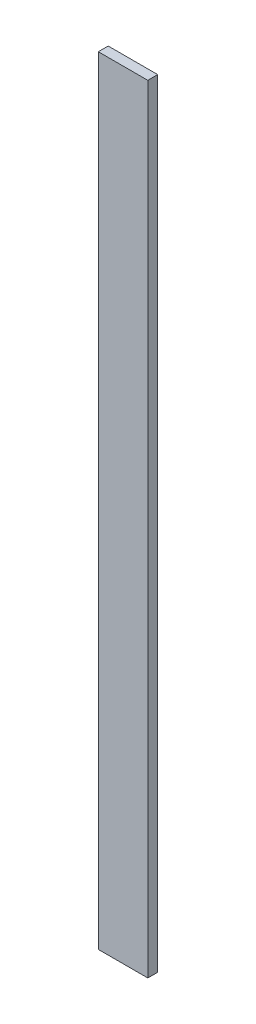
ISO-10303-21;
HEADER;
FILE_DESCRIPTION(('STEP AP214'),'2;1');
FILE_NAME('part.step','',(''),(''),'','','');
FILE_SCHEMA(('AUTOMOTIVE_DESIGN { 1 0 10303 214 1 1 1 1 }'));
ENDSEC;
DATA;
#1=APPLICATION_CONTEXT('core data for automotive mechanical design processes');
#2=APPLICATION_PROTOCOL_DEFINITION('international standard','automotive_design',2000,#1);
#3=PRODUCT_CONTEXT('',#1,'mechanical');
#4=PRODUCT('Part','Part','',(#3));
#5=PRODUCT_RELATED_PRODUCT_CATEGORY('part','',(#4));
#6=PRODUCT_DEFINITION_FORMATION('','',#4);
#7=PRODUCT_DEFINITION_CONTEXT('part definition',#1,'design');
#8=PRODUCT_DEFINITION('design','',#6,#7);
#9=PRODUCT_DEFINITION_SHAPE('','',#8);
#10=(LENGTH_UNIT() NAMED_UNIT(*) SI_UNIT(.MILLI.,.METRE.));
#11=(NAMED_UNIT(*) PLANE_ANGLE_UNIT() SI_UNIT($,.RADIAN.));
#12=(NAMED_UNIT(*) SI_UNIT($,.STERADIAN.) SOLID_ANGLE_UNIT());
#13=UNCERTAINTY_MEASURE_WITH_UNIT(LENGTH_MEASURE(1.E-05),#10,'distance_accuracy_value','');
#14=(GEOMETRIC_REPRESENTATION_CONTEXT(3) GLOBAL_UNCERTAINTY_ASSIGNED_CONTEXT((#13)) GLOBAL_UNIT_ASSIGNED_CONTEXT((#10,
#11,#12)) REPRESENTATION_CONTEXT('',''));
#15=CARTESIAN_POINT('',(0.,0.,0.));
#16=DIRECTION('',(0.,0.,1.));
#17=DIRECTION('',(1.,0.,0.));
#18=AXIS2_PLACEMENT_3D('',#15,#16,#17);
#19=CARTESIAN_POINT('',(196.488368909926,-43.8866022362076,2.));
#20=DIRECTION('',(-1.,0.,0.));
#21=DIRECTION('',(0.,0.,1.));
#22=AXIS2_PLACEMENT_3D('',#19,#20,#21);
#23=PLANE('',#22);
#24=DIRECTION('',(0.,1.,0.));
#25=VECTOR('',#24,1.);
#26=CARTESIAN_POINT('',(196.488368909926,-43.8866022362076,0.));
#27=LINE('',#26,#25);
#28=CARTESIAN_POINT('',(196.488368909926,-200.886602196958,0.));
#29=VERTEX_POINT('',#28);
#30=CARTESIAN_POINT('',(196.488368909926,-43.8866022362076,0.));
#31=VERTEX_POINT('',#30);
#32=EDGE_CURVE('E100',#29,#31,#27,.T.);
#33=ORIENTED_EDGE('',*,*,#32,.T.);
#34=DIRECTION('',(0.,0.,-1.));
#35=VECTOR('',#34,1.);
#36=CARTESIAN_POINT('',(196.488368909926,-43.8866022362076,2.));
#37=LINE('',#36,#35);
#38=CARTESIAN_POINT('',(196.488368909926,-43.8866022362076,2.));
#39=VERTEX_POINT('',#38);
#40=EDGE_CURVE('E11',#39,#31,#37,.T.);
#41=ORIENTED_EDGE('',*,*,#40,.F.);
#42=DIRECTION('',(0.,1.,0.));
#43=VECTOR('',#42,1.);
#44=CARTESIAN_POINT('',(196.488368909926,-43.8866022362076,2.));
#45=LINE('',#44,#43);
#46=CARTESIAN_POINT('',(196.488368909926,-200.886602196958,2.));
#47=VERTEX_POINT('',#46);
#48=EDGE_CURVE('E88',#47,#39,#45,.T.);
#49=ORIENTED_EDGE('',*,*,#48,.F.);
#50=DIRECTION('',(0.,0.,-1.));
#51=VECTOR('',#50,1.);
#52=CARTESIAN_POINT('',(196.488368909926,-200.886602196958,2.));
#53=LINE('',#52,#51);
#54=EDGE_CURVE('E96',#47,#29,#53,.T.);
#55=ORIENTED_EDGE('',*,*,#54,.T.);
#56=EDGE_LOOP('',(#33,#41,#49,#55));
#57=FACE_BOUND('',#56,.T.);
#58=ADVANCED_FACE('F37',(#57),#23,.F.);
#59=CARTESIAN_POINT('',(186.488368912426,-43.8866022362076,2.));
#60=DIRECTION('',(0.,-1.,0.));
#61=DIRECTION('',(0.,0.,-1.));
#62=AXIS2_PLACEMENT_3D('',#59,#60,#61);
#63=PLANE('',#62);
#64=DIRECTION('',(-1.,0.,0.));
#65=VECTOR('',#64,1.);
#66=CARTESIAN_POINT('',(186.488368912426,-43.8866022362076,0.));
#67=LINE('',#66,#65);
#68=CARTESIAN_POINT('',(186.488368912426,-43.8866022362076,0.));
#69=VERTEX_POINT('',#68);
#70=EDGE_CURVE('E92',#31,#69,#67,.T.);
#71=ORIENTED_EDGE('',*,*,#70,.T.);
#72=DIRECTION('',(0.,0.,-1.));
#73=VECTOR('',#72,1.);
#74=CARTESIAN_POINT('',(186.488368912426,-43.8866022362076,2.));
#75=LINE('',#74,#73);
#76=CARTESIAN_POINT('',(186.488368912426,-43.8866022362076,2.));
#77=VERTEX_POINT('',#76);
#78=EDGE_CURVE('E45',#77,#69,#75,.T.);
#79=ORIENTED_EDGE('',*,*,#78,.F.);
#80=DIRECTION('',(-1.,0.,0.));
#81=VECTOR('',#80,1.);
#82=CARTESIAN_POINT('',(186.488368912426,-43.8866022362076,2.));
#83=LINE('',#82,#81);
#84=EDGE_CURVE('E83',#39,#77,#83,.T.);
#85=ORIENTED_EDGE('',*,*,#84,.F.);
#86=ORIENTED_EDGE('',*,*,#40,.T.);
#87=EDGE_LOOP('',(#71,#79,#85,#86));
#88=FACE_BOUND('',#87,.T.);
#89=ADVANCED_FACE('F91',(#88),#63,.F.);
#90=CARTESIAN_POINT('',(186.488368912426,-200.886602196958,2.));
#91=DIRECTION('',(1.,0.,0.));
#92=DIRECTION('',(0.,0.,-1.));
#93=AXIS2_PLACEMENT_3D('',#90,#91,#92);
#94=PLANE('',#93);
#95=DIRECTION('',(0.,-1.,0.));
#96=VECTOR('',#95,1.);
#97=CARTESIAN_POINT('',(186.488368912426,-200.886602196958,0.));
#98=LINE('',#97,#96);
#99=CARTESIAN_POINT('',(186.488368912426,-200.886602196958,0.));
#100=VERTEX_POINT('',#99);
#101=EDGE_CURVE('E70',#69,#100,#98,.T.);
#102=ORIENTED_EDGE('',*,*,#101,.T.);
#103=DIRECTION('',(0.,0.,-1.));
#104=VECTOR('',#103,1.);
#105=CARTESIAN_POINT('',(186.488368912426,-200.886602196958,2.));
#106=LINE('',#105,#104);
#107=CARTESIAN_POINT('',(186.488368912426,-200.886602196958,2.));
#108=VERTEX_POINT('',#107);
#109=EDGE_CURVE('E93',#108,#100,#106,.T.);
#110=ORIENTED_EDGE('',*,*,#109,.F.);
#111=DIRECTION('',(0.,-1.,0.));
#112=VECTOR('',#111,1.);
#113=CARTESIAN_POINT('',(186.488368912426,-200.886602196958,2.));
#114=LINE('',#113,#112);
#115=EDGE_CURVE('E86',#77,#108,#114,.T.);
#116=ORIENTED_EDGE('',*,*,#115,.F.);
#117=ORIENTED_EDGE('',*,*,#78,.T.);
#118=EDGE_LOOP('',(#102,#110,#116,#117));
#119=FACE_BOUND('',#118,.T.);
#120=ADVANCED_FACE('F94',(#119),#94,.F.);
#121=CARTESIAN_POINT('',(196.488368909926,-200.886602196958,2.));
#122=DIRECTION('',(0.,1.,0.));
#123=DIRECTION('',(0.,0.,1.));
#124=AXIS2_PLACEMENT_3D('',#121,#122,#123);
#125=PLANE('',#124);
#126=DIRECTION('',(1.,0.,0.));
#127=VECTOR('',#126,1.);
#128=CARTESIAN_POINT('',(196.488368909926,-200.886602196958,0.));
#129=LINE('',#128,#127);
#130=EDGE_CURVE('E76',#100,#29,#129,.T.);
#131=ORIENTED_EDGE('',*,*,#130,.T.);
#132=ORIENTED_EDGE('',*,*,#54,.F.);
#133=DIRECTION('',(1.,0.,0.));
#134=VECTOR('',#133,1.);
#135=CARTESIAN_POINT('',(196.488368909926,-200.886602196958,2.));
#136=LINE('',#135,#134);
#137=EDGE_CURVE('E53',#108,#47,#136,.T.);
#138=ORIENTED_EDGE('',*,*,#137,.F.);
#139=ORIENTED_EDGE('',*,*,#109,.T.);
#140=EDGE_LOOP('',(#131,#132,#138,#139));
#141=FACE_BOUND('',#140,.T.);
#142=ADVANCED_FACE('F107',(#141),#125,.F.);
#143=CARTESIAN_POINT('',(0.,0.,2.));
#144=DIRECTION('',(0.,0.,-1.));
#145=DIRECTION('',(-1.,0.,0.));
#146=AXIS2_PLACEMENT_3D('',#143,#144,#145);
#147=PLANE('',#146);
#148=ORIENTED_EDGE('',*,*,#48,.T.);
#149=ORIENTED_EDGE('',*,*,#84,.T.);
#150=ORIENTED_EDGE('',*,*,#115,.T.);
#151=ORIENTED_EDGE('',*,*,#137,.T.);
#152=EDGE_LOOP('',(#148,#149,#150,#151));
#153=FACE_BOUND('',#152,.T.);
#154=ADVANCED_FACE('F84',(#153),#147,.F.);
#155=CARTESIAN_POINT('',(0.,0.,0.));
#156=DIRECTION('',(0.,0.,-1.));
#157=DIRECTION('',(-1.,0.,0.));
#158=AXIS2_PLACEMENT_3D('',#155,#156,#157);
#159=PLANE('',#158);
#160=ORIENTED_EDGE('',*,*,#32,.F.);
#161=ORIENTED_EDGE('',*,*,#130,.F.);
#162=ORIENTED_EDGE('',*,*,#101,.F.);
#163=ORIENTED_EDGE('',*,*,#70,.F.);
#164=EDGE_LOOP('',(#160,#161,#162,#163));
#165=FACE_BOUND('',#164,.T.);
#166=ADVANCED_FACE('F110',(#165),#159,.T.);
#167=CLOSED_SHELL('',(#58,#89,#120,#142,#154,#166));
#168=MANIFOLD_SOLID_BREP('B2',#167);
#169=ADVANCED_BREP_SHAPE_REPRESENTATION('',(#18,#168),#14);
#170=SHAPE_DEFINITION_REPRESENTATION(#9,#169);
ENDSEC;
END-ISO-10303-21;
